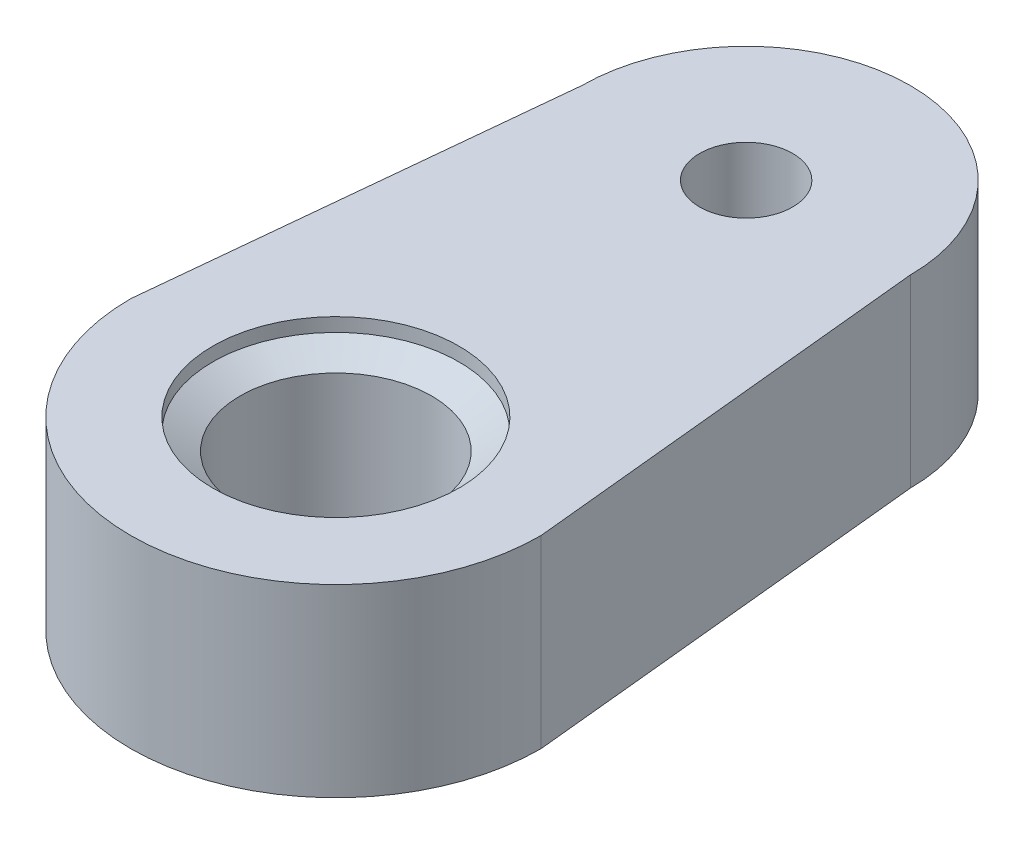
ISO-10303-21;
HEADER;
FILE_DESCRIPTION(('STEP AP214'),'2;1');
FILE_NAME('part.step','',(''),(''),'','','');
FILE_SCHEMA(('AUTOMOTIVE_DESIGN { 1 0 10303 214 1 1 1 1 }'));
ENDSEC;
DATA;
#1=APPLICATION_CONTEXT('core data for automotive mechanical design processes');
#2=APPLICATION_PROTOCOL_DEFINITION('international standard','automotive_design',2000,#1);
#3=PRODUCT_CONTEXT('',#1,'mechanical');
#4=PRODUCT('Part','Part','',(#3));
#5=PRODUCT_RELATED_PRODUCT_CATEGORY('part','',(#4));
#6=PRODUCT_DEFINITION_FORMATION('','',#4);
#7=PRODUCT_DEFINITION_CONTEXT('part definition',#1,'design');
#8=PRODUCT_DEFINITION('design','',#6,#7);
#9=PRODUCT_DEFINITION_SHAPE('','',#8);
#10=(LENGTH_UNIT() NAMED_UNIT(*) SI_UNIT(.MILLI.,.METRE.));
#11=(NAMED_UNIT(*) PLANE_ANGLE_UNIT() SI_UNIT($,.RADIAN.));
#12=(NAMED_UNIT(*) SI_UNIT($,.STERADIAN.) SOLID_ANGLE_UNIT());
#13=UNCERTAINTY_MEASURE_WITH_UNIT(LENGTH_MEASURE(1.E-05),#10,'distance_accuracy_value','');
#14=(GEOMETRIC_REPRESENTATION_CONTEXT(3) GLOBAL_UNCERTAINTY_ASSIGNED_CONTEXT((#13)) GLOBAL_UNIT_ASSIGNED_CONTEXT((#10,
#11,#12)) REPRESENTATION_CONTEXT('',''));
#15=CARTESIAN_POINT('',(0.,0.,0.));
#16=DIRECTION('',(0.,0.,1.));
#17=DIRECTION('',(1.,0.,0.));
#18=AXIS2_PLACEMENT_3D('',#15,#16,#17);
#19=CARTESIAN_POINT('',(0.,1.35,2.77869135699159));
#20=DIRECTION('',(0.,-1.,0.));
#21=DIRECTION('',(0.,0.,-1.));
#22=AXIS2_PLACEMENT_3D('',#19,#20,#21);
#23=CYLINDRICAL_SURFACE('',#22,0.7);
#24=CARTESIAN_POINT('',(0.,1.13452994616208,2.77869135699159));
#25=DIRECTION('',(0.,1.,0.));
#26=DIRECTION('',(0.,0.,1.));
#27=AXIS2_PLACEMENT_3D('',#24,#25,#26);
#28=CIRCLE('',#27,0.7);
#29=CARTESIAN_POINT('',(0.,1.13452994616208,2.07869135699159));
#30=VERTEX_POINT('',#29);
#31=EDGE_CURVE('E11',#30,#30,#28,.T.);
#32=CARTESIAN_POINT('',(0.,0.,2.77869135699159));
#33=DIRECTION('',(0.,1.,0.));
#34=DIRECTION('',(0.,0.,1.));
#35=AXIS2_PLACEMENT_3D('',#32,#33,#34);
#36=CIRCLE('',#35,0.7);
#37=CARTESIAN_POINT('',(0.,0.,2.07869135699159));
#38=VERTEX_POINT('',#37);
#39=EDGE_CURVE('E104',#38,#38,#36,.T.);
#40=CARTESIAN_POINT('',(0.,1.13452994616208,2.07869135699159));
#41=CARTESIAN_POINT('',(0.,1.12271192588956,2.07869135699159));
#42=CARTESIAN_POINT('',(0.,1.11089390561704,2.07869135699159));
#43=CARTESIAN_POINT('',(0.,1.08725786507199,2.07869135699159));
#44=CARTESIAN_POINT('',(0.,1.07543984479947,2.07869135699159));
#45=CARTESIAN_POINT('',(0.,1.05180380425443,2.07869135699159));
#46=CARTESIAN_POINT('',(0.,1.03998578398191,2.07869135699159));
#47=CARTESIAN_POINT('',(0.,1.01634974343686,2.07869135699159));
#48=CARTESIAN_POINT('',(0.,1.00453172316434,2.07869135699159));
#49=CARTESIAN_POINT('',(0.,0.980895682619297,2.07869135699159));
#50=CARTESIAN_POINT('',(0.,0.969077662346776,2.07869135699159));
#51=CARTESIAN_POINT('',(0.,0.945441621801732,2.07869135699159));
#52=CARTESIAN_POINT('',(0.,0.933623601529211,2.07869135699159));
#53=CARTESIAN_POINT('',(0.,0.909987560984168,2.07869135699159));
#54=CARTESIAN_POINT('',(0.,0.898169540711646,2.07869135699159));
#55=CARTESIAN_POINT('',(0.,0.874533500166602,2.07869135699159));
#56=CARTESIAN_POINT('',(0.,0.862715479894081,2.07869135699159));
#57=CARTESIAN_POINT('',(0.,0.839079439349038,2.07869135699159));
#58=CARTESIAN_POINT('',(0.,0.827261419076516,2.07869135699159));
#59=CARTESIAN_POINT('',(0.,0.803625378531473,2.07869135699159));
#60=CARTESIAN_POINT('',(0.,0.791807358258951,2.07869135699159));
#61=CARTESIAN_POINT('',(0.,0.768171317713908,2.07869135699159));
#62=CARTESIAN_POINT('',(0.,0.756353297441386,2.07869135699159));
#63=CARTESIAN_POINT('',(0.,0.732717256896343,2.07869135699159));
#64=CARTESIAN_POINT('',(0.,0.720899236623821,2.07869135699159));
#65=CARTESIAN_POINT('',(0.,0.697263196078778,2.07869135699159));
#66=CARTESIAN_POINT('',(0.,0.685445175806256,2.07869135699159));
#67=CARTESIAN_POINT('',(0.,0.661809135261213,2.07869135699159));
#68=CARTESIAN_POINT('',(0.,0.649991114988691,2.07869135699159));
#69=CARTESIAN_POINT('',(0.,0.626355074443648,2.07869135699159));
#70=CARTESIAN_POINT('',(0.,0.614537054171126,2.07869135699159));
#71=CARTESIAN_POINT('',(0.,0.590901013626083,2.07869135699159));
#72=CARTESIAN_POINT('',(0.,0.579082993353561,2.07869135699159));
#73=CARTESIAN_POINT('',(0.,0.555446952808518,2.07869135699159));
#74=CARTESIAN_POINT('',(0.,0.543628932535996,2.07869135699159));
#75=CARTESIAN_POINT('',(0.,0.519992891990953,2.07869135699159));
#76=CARTESIAN_POINT('',(0.,0.508174871718431,2.07869135699159));
#77=CARTESIAN_POINT('',(0.,0.484538831173388,2.07869135699159));
#78=CARTESIAN_POINT('',(0.,0.472720810900866,2.07869135699159));
#79=CARTESIAN_POINT('',(0.,0.449084770355823,2.07869135699159));
#80=CARTESIAN_POINT('',(0.,0.437266750083301,2.07869135699159));
#81=CARTESIAN_POINT('',(0.,0.413630709538258,2.07869135699159));
#82=CARTESIAN_POINT('',(0.,0.401812689265736,2.07869135699159));
#83=CARTESIAN_POINT('',(0.,0.378176648720693,2.07869135699159));
#84=CARTESIAN_POINT('',(0.,0.366358628448171,2.07869135699159));
#85=CARTESIAN_POINT('',(0.,0.342722587903128,2.07869135699159));
#86=CARTESIAN_POINT('',(0.,0.330904567630606,2.07869135699159));
#87=CARTESIAN_POINT('',(0.,0.307268527085563,2.07869135699159));
#88=CARTESIAN_POINT('',(0.,0.295450506813041,2.07869135699159));
#89=CARTESIAN_POINT('',(0.,0.271814466267998,2.07869135699159));
#90=CARTESIAN_POINT('',(0.,0.259996445995476,2.07869135699159));
#91=CARTESIAN_POINT('',(0.,0.236360405450433,2.07869135699159));
#92=CARTESIAN_POINT('',(0.,0.224542385177911,2.07869135699159));
#93=CARTESIAN_POINT('',(0.,0.200906344632868,2.07869135699159));
#94=CARTESIAN_POINT('',(0.,0.189088324360346,2.07869135699159));
#95=CARTESIAN_POINT('',(0.,0.165452283815303,2.07869135699159));
#96=CARTESIAN_POINT('',(0.,0.153634263542782,2.07869135699159));
#97=CARTESIAN_POINT('',(0.,0.129998222997738,2.07869135699159));
#98=CARTESIAN_POINT('',(0.,0.118180202725216,2.07869135699159));
#99=CARTESIAN_POINT('',(0.,0.0945441621801731,2.07869135699159));
#100=CARTESIAN_POINT('',(0.,0.0827261419076515,2.07869135699159));
#101=CARTESIAN_POINT('',(0.,0.0590901013626083,2.07869135699159));
#102=CARTESIAN_POINT('',(0.,0.0472720810900867,2.07869135699159));
#103=CARTESIAN_POINT('',(0.,0.0236360405450433,2.07869135699159));
#104=CARTESIAN_POINT('',(0.,0.0118180202725215,2.07869135699159));
#105=CARTESIAN_POINT('',(0.,0.,2.07869135699159));
#106=B_SPLINE_CURVE_WITH_KNOTS('',3,(#40,#41,#42,#43,#44,#45,#46,#47,#48,#49,#50,#51,#52,#53,
#54,#55,#56,#57,#58,#59,#60,#61,#62,#63,#64,#65,#66,#67,#68,#69,#70,#71,#72,#73,#74,#75,#76,#77,
#78,#79,#80,#81,#82,#83,#84,#85,#86,#87,#88,#89,#90,#91,#92,#93,#94,#95,#96,#97,#98,#99,#100,
#101,#102,#103,#104,#105),.UNSPECIFIED.,.F.,.F.,(4,2,2,2,2,2,2,2,2,2,2,2,2,2,2,2,2,2,2,2,2,2,2,
2,2,2,2,2,2,2,2,2,4),(0.,0.035454060817565,0.0709081216351301,0.106362182452695,
0.14181624327026,0.177270304087825,0.21272436490539,0.248178425722955,0.28363248654052,
0.319086547358085,0.35454060817565,0.389994668993215,0.42544872981078,0.460902790628345,
0.49635685144591,0.531810912263475,0.56726497308104,0.602719033898605,0.63817309471617,
0.673627155533735,0.7090812163513,0.744535277168864,0.779989337986429,0.815443398803995,
0.850897459621559,0.886351520439124,0.921805581256689,0.957259642074254,0.992713702891819,
1.02816776370938,1.06362182452695,1.09907588534451,1.13452994616208),.UNSPECIFIED.);
#107=EDGE_CURVE('BSEAM32',#30,#38,#106,.T.);
#108=ORIENTED_EDGE('',*,*,#31,.T.);
#109=ORIENTED_EDGE('',*,*,#39,.F.);
#110=ORIENTED_EDGE('',*,*,#107,.T.);
#111=ORIENTED_EDGE('',*,*,#107,.F.);
#112=EDGE_LOOP('',(#108,#110,#109,#111));
#113=FACE_BOUND('',#112,.T.);
#114=ADVANCED_FACE('F32',(#113),#23,.F.);
#115=CARTESIAN_POINT('',(0.,1.35,-0.221308643008406));
#116=DIRECTION('',(0.,1.,0.));
#117=DIRECTION('',(0.,0.,1.));
#118=AXIS2_PLACEMENT_3D('',#115,#116,#117);
#119=PLANE('',#118);
#120=CARTESIAN_POINT('',(0.,1.35,2.77869135699159));
#121=DIRECTION('',(0.,1.,0.));
#122=DIRECTION('',(0.,0.,1.));
#123=AXIS2_PLACEMENT_3D('',#120,#121,#122);
#124=CIRCLE('',#123,0.9);
#125=CARTESIAN_POINT('',(0.,1.35,3.67869135699159));
#126=VERTEX_POINT('',#125);
#127=EDGE_CURVE('E133',#126,#126,#124,.T.);
#128=ORIENTED_EDGE('',*,*,#127,.F.);
#129=EDGE_LOOP('',(#128));
#130=FACE_BOUND('',#129,.T.);
#131=CARTESIAN_POINT('',(0.,1.35,-0.221308643008406));
#132=DIRECTION('',(0.,1.,0.));
#133=DIRECTION('',(0.,0.,1.));
#134=AXIS2_PLACEMENT_3D('',#131,#132,#133);
#135=CIRCLE('',#134,1.2);
#136=CARTESIAN_POINT('',(1.2,1.35,-0.221308643008406));
#137=VERTEX_POINT('',#136);
#138=CARTESIAN_POINT('',(-1.2,1.35,-0.221308643008406));
#139=VERTEX_POINT('',#138);
#140=EDGE_CURVE('E86',#137,#139,#135,.T.);
#141=ORIENTED_EDGE('',*,*,#140,.T.);
#142=DIRECTION('',(-0.0995037190209989,0.,0.995037190209989));
#143=VECTOR('',#142,1.);
#144=CARTESIAN_POINT('',(-1.2,1.35,-0.221308643008406));
#145=LINE('',#144,#143);
#146=CARTESIAN_POINT('',(-1.5,1.35,2.77869135699159));
#147=VERTEX_POINT('',#146);
#148=EDGE_CURVE('E80',#139,#147,#145,.T.);
#149=ORIENTED_EDGE('',*,*,#148,.T.);
#150=CARTESIAN_POINT('',(0.,1.35,2.77869135699159));
#151=DIRECTION('',(0.,1.,0.));
#152=DIRECTION('',(0.,0.,1.));
#153=AXIS2_PLACEMENT_3D('',#150,#151,#152);
#154=CIRCLE('',#153,1.5);
#155=CARTESIAN_POINT('',(1.5,1.35,2.77869135699159));
#156=VERTEX_POINT('',#155);
#157=EDGE_CURVE('E84',#147,#156,#154,.T.);
#158=ORIENTED_EDGE('',*,*,#157,.T.);
#159=DIRECTION('',(-0.0995037190209989,0.,-0.995037190209989));
#160=VECTOR('',#159,1.);
#161=CARTESIAN_POINT('',(1.2,1.35,-0.221308643008406));
#162=LINE('',#161,#160);
#163=EDGE_CURVE('E49',#156,#137,#162,.T.);
#164=ORIENTED_EDGE('',*,*,#163,.T.);
#165=EDGE_LOOP('',(#141,#149,#158,#164));
#166=FACE_BOUND('',#165,.T.);
#167=CARTESIAN_POINT('',(0.,1.35,-0.221308643008406));
#168=DIRECTION('',(0.,1.,0.));
#169=DIRECTION('',(0.,0.,1.));
#170=AXIS2_PLACEMENT_3D('',#167,#168,#169);
#171=CIRCLE('',#170,0.34);
#172=CARTESIAN_POINT('',(0.,1.35,0.118691356991594));
#173=VERTEX_POINT('',#172);
#174=EDGE_CURVE('E126',#173,#173,#171,.T.);
#175=ORIENTED_EDGE('',*,*,#174,.F.);
#176=EDGE_LOOP('',(#175));
#177=FACE_BOUND('',#176,.T.);
#178=ADVANCED_FACE('F81',(#130,#166,#177),#119,.T.);
#179=CARTESIAN_POINT('',(0.,0.,-0.221308643008406));
#180=DIRECTION('',(0.,1.,0.));
#181=DIRECTION('',(0.,0.,1.));
#182=AXIS2_PLACEMENT_3D('',#179,#180,#181);
#183=PLANE('',#182);
#184=ORIENTED_EDGE('',*,*,#39,.T.);
#185=EDGE_LOOP('',(#184));
#186=FACE_BOUND('',#185,.T.);
#187=CARTESIAN_POINT('',(0.,0.,-0.221308643008406));
#188=DIRECTION('',(0.,1.,0.));
#189=DIRECTION('',(0.,0.,1.));
#190=AXIS2_PLACEMENT_3D('',#187,#188,#189);
#191=CIRCLE('',#190,1.2);
#192=CARTESIAN_POINT('',(1.2,0.,-0.221308643008406));
#193=VERTEX_POINT('',#192);
#194=CARTESIAN_POINT('',(-1.2,0.,-0.221308643008406));
#195=VERTEX_POINT('',#194);
#196=EDGE_CURVE('E101',#193,#195,#191,.T.);
#197=ORIENTED_EDGE('',*,*,#196,.F.);
#198=DIRECTION('',(-0.0995037190209989,0.,-0.995037190209989));
#199=VECTOR('',#198,1.);
#200=CARTESIAN_POINT('',(1.2,0.,-0.221308643008406));
#201=LINE('',#200,#199);
#202=CARTESIAN_POINT('',(1.5,0.,2.77869135699159));
#203=VERTEX_POINT('',#202);
#204=EDGE_CURVE('E72',#203,#193,#201,.T.);
#205=ORIENTED_EDGE('',*,*,#204,.F.);
#206=CARTESIAN_POINT('',(0.,0.,2.77869135699159));
#207=DIRECTION('',(0.,1.,0.));
#208=DIRECTION('',(0.,0.,1.));
#209=AXIS2_PLACEMENT_3D('',#206,#207,#208);
#210=CIRCLE('',#209,1.5);
#211=CARTESIAN_POINT('',(-1.5,0.,2.77869135699159));
#212=VERTEX_POINT('',#211);
#213=EDGE_CURVE('E66',#212,#203,#210,.T.);
#214=ORIENTED_EDGE('',*,*,#213,.F.);
#215=DIRECTION('',(-0.0995037190209989,0.,0.995037190209989));
#216=VECTOR('',#215,1.);
#217=CARTESIAN_POINT('',(-1.2,0.,-0.221308643008406));
#218=LINE('',#217,#216);
#219=EDGE_CURVE('E91',#195,#212,#218,.T.);
#220=ORIENTED_EDGE('',*,*,#219,.F.);
#221=EDGE_LOOP('',(#197,#205,#214,#220));
#222=FACE_BOUND('',#221,.T.);
#223=CARTESIAN_POINT('',(0.,0.,-0.221308643008406));
#224=DIRECTION('',(0.,1.,0.));
#225=DIRECTION('',(0.,0.,1.));
#226=AXIS2_PLACEMENT_3D('',#223,#224,#225);
#227=CIRCLE('',#226,0.34);
#228=CARTESIAN_POINT('',(0.,0.,0.118691356991594));
#229=VERTEX_POINT('',#228);
#230=EDGE_CURVE('E129',#229,#229,#227,.T.);
#231=ORIENTED_EDGE('',*,*,#230,.T.);
#232=EDGE_LOOP('',(#231));
#233=FACE_BOUND('',#232,.T.);
#234=ADVANCED_FACE('F139',(#186,#222,#233),#183,.F.);
#235=CARTESIAN_POINT('',(0.,1.35,-0.221308643008406));
#236=DIRECTION('',(0.,-1.,0.));
#237=DIRECTION('',(0.,0.,-1.));
#238=AXIS2_PLACEMENT_3D('',#235,#236,#237);
#239=CYLINDRICAL_SURFACE('',#238,1.2);
#240=ORIENTED_EDGE('',*,*,#196,.T.);
#241=DIRECTION('',(0.,-1.,0.));
#242=VECTOR('',#241,1.);
#243=CARTESIAN_POINT('',(-1.2,1.35,-0.221308643008406));
#244=LINE('',#243,#242);
#245=EDGE_CURVE('E92',#139,#195,#244,.T.);
#246=ORIENTED_EDGE('',*,*,#245,.F.);
#247=ORIENTED_EDGE('',*,*,#140,.F.);
#248=DIRECTION('',(0.,-1.,0.));
#249=VECTOR('',#248,1.);
#250=CARTESIAN_POINT('',(1.2,1.35,-0.221308643008406));
#251=LINE('',#250,#249);
#252=EDGE_CURVE('E97',#137,#193,#251,.T.);
#253=ORIENTED_EDGE('',*,*,#252,.T.);
#254=EDGE_LOOP('',(#240,#246,#247,#253));
#255=FACE_BOUND('',#254,.T.);
#256=ADVANCED_FACE('F144',(#255),#239,.T.);
#257=CARTESIAN_POINT('',(-1.2,1.35,-0.221308643008406));
#258=DIRECTION('',(0.995037190209989,0.,0.099503719020999));
#259=DIRECTION('',(0.099503719020999,0.,-0.995037190209989));
#260=AXIS2_PLACEMENT_3D('',#257,#258,#259);
#261=PLANE('',#260);
#262=ORIENTED_EDGE('',*,*,#219,.T.);
#263=DIRECTION('',(0.,-1.,0.));
#264=VECTOR('',#263,1.);
#265=CARTESIAN_POINT('',(-1.5,1.35,2.77869135699159));
#266=LINE('',#265,#264);
#267=EDGE_CURVE('E89',#147,#212,#266,.T.);
#268=ORIENTED_EDGE('',*,*,#267,.F.);
#269=ORIENTED_EDGE('',*,*,#148,.F.);
#270=ORIENTED_EDGE('',*,*,#245,.T.);
#271=EDGE_LOOP('',(#262,#268,#269,#270));
#272=FACE_BOUND('',#271,.T.);
#273=ADVANCED_FACE('F90',(#272),#261,.F.);
#274=CARTESIAN_POINT('',(0.,1.35,2.77869135699159));
#275=DIRECTION('',(0.,-1.,0.));
#276=DIRECTION('',(0.,0.,-1.));
#277=AXIS2_PLACEMENT_3D('',#274,#275,#276);
#278=CYLINDRICAL_SURFACE('',#277,1.5);
#279=ORIENTED_EDGE('',*,*,#213,.T.);
#280=DIRECTION('',(0.,-1.,0.));
#281=VECTOR('',#280,1.);
#282=CARTESIAN_POINT('',(1.5,1.35,2.77869135699159));
#283=LINE('',#282,#281);
#284=EDGE_CURVE('E93',#156,#203,#283,.T.);
#285=ORIENTED_EDGE('',*,*,#284,.F.);
#286=ORIENTED_EDGE('',*,*,#157,.F.);
#287=ORIENTED_EDGE('',*,*,#267,.T.);
#288=EDGE_LOOP('',(#279,#285,#286,#287));
#289=FACE_BOUND('',#288,.T.);
#290=ADVANCED_FACE('F95',(#289),#278,.T.);
#291=CARTESIAN_POINT('',(1.2,1.35,-0.221308643008406));
#292=DIRECTION('',(-0.995037190209989,0.,0.099503719020999));
#293=DIRECTION('',(0.099503719020999,0.,0.995037190209989));
#294=AXIS2_PLACEMENT_3D('',#291,#292,#293);
#295=PLANE('',#294);
#296=ORIENTED_EDGE('',*,*,#204,.T.);
#297=ORIENTED_EDGE('',*,*,#252,.F.);
#298=ORIENTED_EDGE('',*,*,#163,.F.);
#299=ORIENTED_EDGE('',*,*,#284,.T.);
#300=EDGE_LOOP('',(#296,#297,#298,#299));
#301=FACE_BOUND('',#300,.T.);
#302=ADVANCED_FACE('F148',(#301),#295,.F.);
#303=CARTESIAN_POINT('',(0.,1.35,-0.221308643008406));
#304=DIRECTION('',(0.,-1.,0.));
#305=DIRECTION('',(0.,0.,-1.));
#306=AXIS2_PLACEMENT_3D('',#303,#304,#305);
#307=CYLINDRICAL_SURFACE('',#306,0.34);
#308=ORIENTED_EDGE('',*,*,#174,.T.);
#309=EDGE_LOOP('',(#308));
#310=FACE_BOUND('',#309,.T.);
#311=ORIENTED_EDGE('',*,*,#230,.F.);
#312=EDGE_LOOP('',(#311));
#313=FACE_BOUND('',#312,.T.);
#314=ADVANCED_FACE('F151',(#310,#313),#307,.F.);
#315=CARTESIAN_POINT('',(0.,1.,2.77869135699159));
#316=DIRECTION('',(0.,1.,0.));
#317=DIRECTION('',(0.,0.,1.));
#318=AXIS2_PLACEMENT_3D('',#315,#316,#317);
#319=CYLINDRICAL_SURFACE('',#318,0.9);
#320=CARTESIAN_POINT('',(0.,1.25,2.77869135699159));
#321=DIRECTION('',(0.,1.,0.));
#322=DIRECTION('',(0.,0.,1.));
#323=AXIS2_PLACEMENT_3D('',#320,#321,#322);
#324=CIRCLE('',#323,0.9);
#325=CARTESIAN_POINT('',(0.,1.25,3.67869135699159));
#326=VERTEX_POINT('',#325);
#327=EDGE_CURVE('E41',#326,#326,#324,.F.);
#328=ORIENTED_EDGE('',*,*,#327,.T.);
#329=EDGE_LOOP('',(#328));
#330=FACE_BOUND('',#329,.T.);
#331=ORIENTED_EDGE('',*,*,#127,.T.);
#332=EDGE_LOOP('',(#331));
#333=FACE_BOUND('',#332,.T.);
#334=ADVANCED_FACE('F113',(#330,#333),#319,.F.);
#335=CARTESIAN_POINT('',(0.,1.,2.77869135699159));
#336=DIRECTION('',(0.,1.,0.));
#337=DIRECTION('',(0.,0.,1.));
#338=AXIS2_PLACEMENT_3D('',#335,#336,#337);
#339=CONICAL_SURFACE('',#338,0.466987298107771,1.0471975511966);
#340=ORIENTED_EDGE('',*,*,#327,.F.);
#341=EDGE_LOOP('',(#340));
#342=FACE_BOUND('',#341,.T.);
#343=ORIENTED_EDGE('',*,*,#31,.F.);
#344=EDGE_LOOP('',(#343));
#345=FACE_BOUND('',#344,.T.);
#346=ADVANCED_FACE('F34',(#342,#345),#339,.F.);
#347=CLOSED_SHELL('',(#114,#178,#234,#256,#273,#290,#302,#314,#334,#346));
#348=MANIFOLD_SOLID_BREP('B2',#347);
#349=ADVANCED_BREP_SHAPE_REPRESENTATION('',(#18,#348),#14);
#350=SHAPE_DEFINITION_REPRESENTATION(#9,#349);
ENDSEC;
END-ISO-10303-21;
